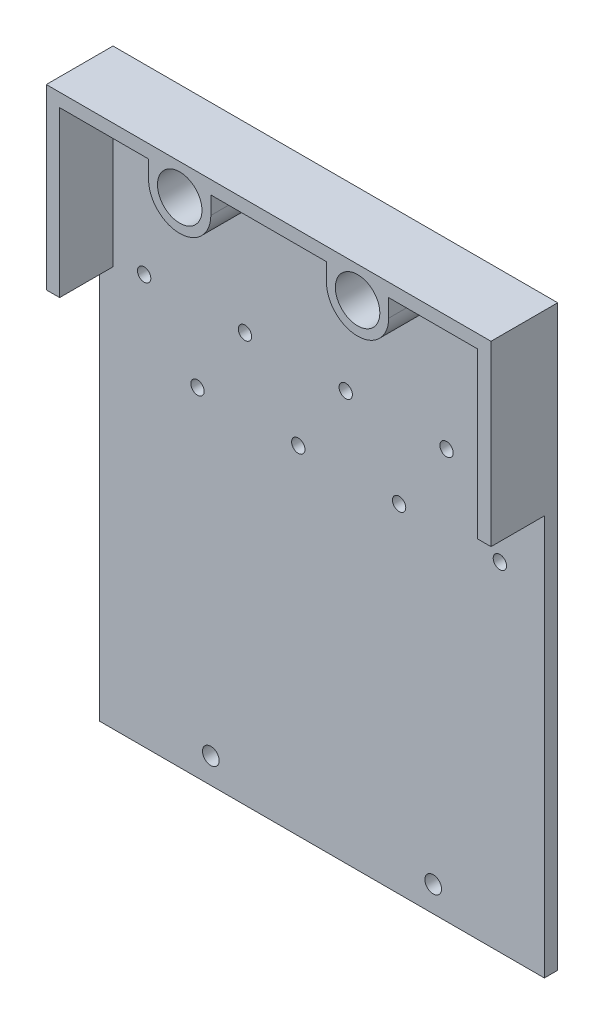
ISO-10303-21;
HEADER;
FILE_DESCRIPTION(('STEP AP214'),'2;1');
FILE_NAME('part.step','',(''),(''),'','','');
FILE_SCHEMA(('AUTOMOTIVE_DESIGN { 1 0 10303 214 1 1 1 1 }'));
ENDSEC;
DATA;
#1=APPLICATION_CONTEXT('core data for automotive mechanical design processes');
#2=APPLICATION_PROTOCOL_DEFINITION('international standard','automotive_design',2000,#1);
#3=PRODUCT_CONTEXT('',#1,'mechanical');
#4=PRODUCT('Part','Part','',(#3));
#5=PRODUCT_RELATED_PRODUCT_CATEGORY('part','',(#4));
#6=PRODUCT_DEFINITION_FORMATION('','',#4);
#7=PRODUCT_DEFINITION_CONTEXT('part definition',#1,'design');
#8=PRODUCT_DEFINITION('design','',#6,#7);
#9=PRODUCT_DEFINITION_SHAPE('','',#8);
#10=(LENGTH_UNIT() NAMED_UNIT(*) SI_UNIT(.MILLI.,.METRE.));
#11=(NAMED_UNIT(*) PLANE_ANGLE_UNIT() SI_UNIT($,.RADIAN.));
#12=(NAMED_UNIT(*) SI_UNIT($,.STERADIAN.) SOLID_ANGLE_UNIT());
#13=UNCERTAINTY_MEASURE_WITH_UNIT(LENGTH_MEASURE(1.E-05),#10,'distance_accuracy_value','');
#14=(GEOMETRIC_REPRESENTATION_CONTEXT(3) GLOBAL_UNCERTAINTY_ASSIGNED_CONTEXT((#13)) GLOBAL_UNIT_ASSIGNED_CONTEXT((#10,
#11,#12)) REPRESENTATION_CONTEXT('',''));
#15=CARTESIAN_POINT('',(0.,0.,0.));
#16=DIRECTION('',(0.,0.,1.));
#17=DIRECTION('',(1.,0.,0.));
#18=AXIS2_PLACEMENT_3D('',#15,#16,#17);
#19=CARTESIAN_POINT('',(0.,0.,3.));
#20=DIRECTION('',(0.,0.,1.));
#21=DIRECTION('',(1.,0.,0.));
#22=AXIS2_PLACEMENT_3D('',#19,#20,#21);
#23=PLANE('',#22);
#24=DIRECTION('',(1.,0.,0.));
#25=VECTOR('',#24,1.);
#26=CARTESIAN_POINT('',(0.,90.,3.));
#27=LINE('',#26,#25);
#28=CARTESIAN_POINT('',(0.,90.,3.));
#29=VERTEX_POINT('',#28);
#30=CARTESIAN_POINT('',(3.00000000000001,90.,3.));
#31=VERTEX_POINT('',#30);
#32=EDGE_CURVE('E351',#29,#31,#27,.T.);
#33=ORIENTED_EDGE('',*,*,#32,.F.);
#34=DIRECTION('',(0.,1.,0.));
#35=VECTOR('',#34,1.);
#36=CARTESIAN_POINT('',(0.,0.,3.));
#37=LINE('',#36,#35);
#38=CARTESIAN_POINT('',(0.,0.,3.));
#39=VERTEX_POINT('',#38);
#40=EDGE_CURVE('E379',#39,#29,#37,.T.);
#41=ORIENTED_EDGE('',*,*,#40,.F.);
#42=DIRECTION('',(1.,0.,0.));
#43=VECTOR('',#42,1.);
#44=CARTESIAN_POINT('',(0.,0.,3.));
#45=LINE('',#44,#43);
#46=CARTESIAN_POINT('',(100.,0.,3.));
#47=VERTEX_POINT('',#46);
#48=EDGE_CURVE('E56',#39,#47,#45,.T.);
#49=ORIENTED_EDGE('',*,*,#48,.T.);
#50=DIRECTION('',(0.,1.,0.));
#51=VECTOR('',#50,1.);
#52=CARTESIAN_POINT('',(100.,0.,3.));
#53=LINE('',#52,#51);
#54=CARTESIAN_POINT('',(100.,90.,3.));
#55=VERTEX_POINT('',#54);
#56=EDGE_CURVE('E383',#47,#55,#53,.T.);
#57=ORIENTED_EDGE('',*,*,#56,.T.);
#58=DIRECTION('',(1.,0.,0.));
#59=VECTOR('',#58,1.);
#60=CARTESIAN_POINT('',(0.,90.,3.));
#61=LINE('',#60,#59);
#62=CARTESIAN_POINT('',(97.,90.,3.));
#63=VERTEX_POINT('',#62);
#64=EDGE_CURVE('E327',#63,#55,#61,.T.);
#65=ORIENTED_EDGE('',*,*,#64,.F.);
#66=DIRECTION('',(0.,1.,0.));
#67=VECTOR('',#66,1.);
#68=CARTESIAN_POINT('',(97.,0.,3.));
#69=LINE('',#68,#67);
#70=CARTESIAN_POINT('',(97.,127.,3.));
#71=VERTEX_POINT('',#70);
#72=EDGE_CURVE('E330',#63,#71,#69,.T.);
#73=ORIENTED_EDGE('',*,*,#72,.T.);
#74=DIRECTION('',(1.,0.,0.));
#75=VECTOR('',#74,1.);
#76=CARTESIAN_POINT('',(0.,127.,3.));
#77=LINE('',#76,#75);
#78=CARTESIAN_POINT('',(77.,127.,3.));
#79=VERTEX_POINT('',#78);
#80=EDGE_CURVE('E385',#79,#71,#77,.T.);
#81=ORIENTED_EDGE('',*,*,#80,.F.);
#82=DIRECTION('',(0.,-1.,0.));
#83=VECTOR('',#82,1.);
#84=CARTESIAN_POINT('',(77.,0.,3.));
#85=LINE('',#84,#83);
#86=CARTESIAN_POINT('',(77.,123.,3.));
#87=VERTEX_POINT('',#86);
#88=EDGE_CURVE('E333',#79,#87,#85,.T.);
#89=ORIENTED_EDGE('',*,*,#88,.T.);
#90=CARTESIAN_POINT('',(70.,123.,3.));
#91=DIRECTION('',(0.,0.,1.));
#92=DIRECTION('',(1.,0.,0.));
#93=AXIS2_PLACEMENT_3D('',#90,#91,#92);
#94=CIRCLE('',#93,7.);
#95=CARTESIAN_POINT('',(63.,123.,3.));
#96=VERTEX_POINT('',#95);
#97=EDGE_CURVE('E336',#87,#96,#94,.F.);
#98=ORIENTED_EDGE('',*,*,#97,.T.);
#99=DIRECTION('',(0.,-1.,0.));
#100=VECTOR('',#99,1.);
#101=CARTESIAN_POINT('',(63.,0.,3.));
#102=LINE('',#101,#100);
#103=CARTESIAN_POINT('',(63.,127.,3.));
#104=VERTEX_POINT('',#103);
#105=EDGE_CURVE('E339',#104,#96,#102,.T.);
#106=ORIENTED_EDGE('',*,*,#105,.F.);
#107=DIRECTION('',(1.,0.,0.));
#108=VECTOR('',#107,1.);
#109=CARTESIAN_POINT('',(0.,127.,3.));
#110=LINE('',#109,#108);
#111=CARTESIAN_POINT('',(37.,127.,3.));
#112=VERTEX_POINT('',#111);
#113=EDGE_CURVE('E373',#112,#104,#110,.T.);
#114=ORIENTED_EDGE('',*,*,#113,.F.);
#115=DIRECTION('',(0.,-1.,0.));
#116=VECTOR('',#115,1.);
#117=CARTESIAN_POINT('',(37.,0.,3.));
#118=LINE('',#117,#116);
#119=CARTESIAN_POINT('',(37.,123.,3.));
#120=VERTEX_POINT('',#119);
#121=EDGE_CURVE('E342',#112,#120,#118,.T.);
#122=ORIENTED_EDGE('',*,*,#121,.T.);
#123=CARTESIAN_POINT('',(30.,123.,3.));
#124=DIRECTION('',(0.,0.,1.));
#125=DIRECTION('',(1.,0.,0.));
#126=AXIS2_PLACEMENT_3D('',#123,#124,#125);
#127=CIRCLE('',#126,7.00000000000001);
#128=CARTESIAN_POINT('',(23.,123.,3.));
#129=VERTEX_POINT('',#128);
#130=EDGE_CURVE('E116',#129,#120,#127,.T.);
#131=ORIENTED_EDGE('',*,*,#130,.F.);
#132=DIRECTION('',(0.,-1.,0.));
#133=VECTOR('',#132,1.);
#134=CARTESIAN_POINT('',(23.,0.,3.));
#135=LINE('',#134,#133);
#136=CARTESIAN_POINT('',(23.,127.,3.));
#137=VERTEX_POINT('',#136);
#138=EDGE_CURVE('E345',#137,#129,#135,.T.);
#139=ORIENTED_EDGE('',*,*,#138,.F.);
#140=DIRECTION('',(1.,0.,0.));
#141=VECTOR('',#140,1.);
#142=CARTESIAN_POINT('',(0.,127.,3.));
#143=LINE('',#142,#141);
#144=CARTESIAN_POINT('',(3.,127.,3.));
#145=VERTEX_POINT('',#144);
#146=EDGE_CURVE('E376',#145,#137,#143,.T.);
#147=ORIENTED_EDGE('',*,*,#146,.F.);
#148=DIRECTION('',(0.,-1.,0.));
#149=VECTOR('',#148,1.);
#150=CARTESIAN_POINT('',(3.00000000000002,0.,3.));
#151=LINE('',#150,#149);
#152=EDGE_CURVE('E348',#145,#31,#151,.T.);
#153=ORIENTED_EDGE('',*,*,#152,.T.);
#154=EDGE_LOOP('',(#33,#41,#49,#57,#65,#73,#81,#89,#98,#106,#114,#122,#131,#139,#147,#153));
#155=FACE_BOUND('',#154,.T.);
#156=CARTESIAN_POINT('',(44.6666666666667,76.,3.));
#157=DIRECTION('',(0.,0.,1.));
#158=DIRECTION('',(1.,0.,0.));
#159=AXIS2_PLACEMENT_3D('',#156,#157,#158);
#160=CIRCLE('',#159,1.5);
#161=CARTESIAN_POINT('',(46.1666666666667,76.,3.));
#162=VERTEX_POINT('',#161);
#163=EDGE_CURVE('E355',#162,#162,#160,.T.);
#164=ORIENTED_EDGE('',*,*,#163,.F.);
#165=EDGE_LOOP('',(#164));
#166=FACE_BOUND('',#165,.T.);
#167=CARTESIAN_POINT('',(32.6666666666666,92.,3.));
#168=DIRECTION('',(0.,0.,1.));
#169=DIRECTION('',(1.,0.,0.));
#170=AXIS2_PLACEMENT_3D('',#167,#168,#169);
#171=CIRCLE('',#170,1.5);
#172=CARTESIAN_POINT('',(34.1666666666666,92.,3.));
#173=VERTEX_POINT('',#172);
#174=EDGE_CURVE('E359',#173,#173,#171,.T.);
#175=ORIENTED_EDGE('',*,*,#174,.F.);
#176=EDGE_LOOP('',(#175));
#177=FACE_BOUND('',#176,.T.);
#178=CARTESIAN_POINT('',(9.9999999999999,92.,3.));
#179=DIRECTION('',(0.,0.,1.));
#180=DIRECTION('',(1.,0.,0.));
#181=AXIS2_PLACEMENT_3D('',#178,#179,#180);
#182=CIRCLE('',#181,1.5);
#183=CARTESIAN_POINT('',(11.4999999999999,92.,3.));
#184=VERTEX_POINT('',#183);
#185=EDGE_CURVE('E363',#184,#184,#182,.T.);
#186=ORIENTED_EDGE('',*,*,#185,.F.);
#187=EDGE_LOOP('',(#186));
#188=FACE_BOUND('',#187,.T.);
#189=CARTESIAN_POINT('',(22.,76.,3.));
#190=DIRECTION('',(0.,0.,1.));
#191=DIRECTION('',(1.,0.,0.));
#192=AXIS2_PLACEMENT_3D('',#189,#190,#191);
#193=CIRCLE('',#192,1.5);
#194=CARTESIAN_POINT('',(23.5,76.,3.));
#195=VERTEX_POINT('',#194);
#196=EDGE_CURVE('E364',#195,#195,#193,.T.);
#197=ORIENTED_EDGE('',*,*,#196,.F.);
#198=EDGE_LOOP('',(#197));
#199=FACE_BOUND('',#198,.T.);
#200=CARTESIAN_POINT('',(25.,5.74999999999999,3.));
#201=DIRECTION('',(0.,0.,1.));
#202=DIRECTION('',(1.,0.,0.));
#203=AXIS2_PLACEMENT_3D('',#200,#201,#202);
#204=CIRCLE('',#203,1.875);
#205=CARTESIAN_POINT('',(26.875,5.74999999999999,3.));
#206=VERTEX_POINT('',#205);
#207=EDGE_CURVE('E388',#206,#206,#204,.T.);
#208=ORIENTED_EDGE('',*,*,#207,.F.);
#209=EDGE_LOOP('',(#208));
#210=FACE_BOUND('',#209,.T.);
#211=CARTESIAN_POINT('',(75.,5.75,3.));
#212=DIRECTION('',(0.,0.,1.));
#213=DIRECTION('',(1.,0.,0.));
#214=AXIS2_PLACEMENT_3D('',#211,#212,#213);
#215=CIRCLE('',#214,1.875);
#216=CARTESIAN_POINT('',(76.875,5.75,3.));
#217=VERTEX_POINT('',#216);
#218=EDGE_CURVE('E98',#217,#217,#215,.T.);
#219=ORIENTED_EDGE('',*,*,#218,.F.);
#220=EDGE_LOOP('',(#219));
#221=FACE_BOUND('',#220,.T.);
#222=CARTESIAN_POINT('',(55.3333333333333,92.,3.));
#223=DIRECTION('',(0.,0.,1.));
#224=DIRECTION('',(1.,0.,0.));
#225=AXIS2_PLACEMENT_3D('',#222,#223,#224);
#226=CIRCLE('',#225,1.5);
#227=CARTESIAN_POINT('',(56.8333333333333,92.,3.));
#228=VERTEX_POINT('',#227);
#229=EDGE_CURVE('E126',#228,#228,#226,.T.);
#230=ORIENTED_EDGE('',*,*,#229,.F.);
#231=EDGE_LOOP('',(#230));
#232=FACE_BOUND('',#231,.T.);
#233=CARTESIAN_POINT('',(77.9999999999999,92.,3.));
#234=DIRECTION('',(0.,0.,1.));
#235=DIRECTION('',(1.,0.,0.));
#236=AXIS2_PLACEMENT_3D('',#233,#234,#235);
#237=CIRCLE('',#236,1.5);
#238=CARTESIAN_POINT('',(79.4999999999999,92.,3.));
#239=VERTEX_POINT('',#238);
#240=EDGE_CURVE('E132',#239,#239,#237,.T.);
#241=ORIENTED_EDGE('',*,*,#240,.F.);
#242=EDGE_LOOP('',(#241));
#243=FACE_BOUND('',#242,.T.);
#244=CARTESIAN_POINT('',(67.3333333333333,76.,3.));
#245=DIRECTION('',(0.,0.,1.));
#246=DIRECTION('',(1.,0.,0.));
#247=AXIS2_PLACEMENT_3D('',#244,#245,#246);
#248=CIRCLE('',#247,1.5);
#249=CARTESIAN_POINT('',(68.8333333333333,76.,3.));
#250=VERTEX_POINT('',#249);
#251=EDGE_CURVE('E138',#250,#250,#248,.T.);
#252=ORIENTED_EDGE('',*,*,#251,.F.);
#253=EDGE_LOOP('',(#252));
#254=FACE_BOUND('',#253,.T.);
#255=CARTESIAN_POINT('',(90.,76.,3.));
#256=DIRECTION('',(0.,0.,1.));
#257=DIRECTION('',(1.,0.,0.));
#258=AXIS2_PLACEMENT_3D('',#255,#256,#257);
#259=CIRCLE('',#258,1.5);
#260=CARTESIAN_POINT('',(91.5,76.,3.));
#261=VERTEX_POINT('',#260);
#262=EDGE_CURVE('E11',#261,#261,#259,.T.);
#263=ORIENTED_EDGE('',*,*,#262,.F.);
#264=EDGE_LOOP('',(#263));
#265=FACE_BOUND('',#264,.T.);
#266=ADVANCED_FACE('F39',(#155,#166,#177,#188,#199,#210,#221,#232,#243,#254,#265),#23,.T.);
#267=CARTESIAN_POINT('',(90.,76.,7.24264068711929));
#268=DIRECTION('',(0.,0.,-1.));
#269=DIRECTION('',(-1.,0.,0.));
#270=AXIS2_PLACEMENT_3D('',#267,#268,#269);
#271=CYLINDRICAL_SURFACE('',#270,1.5);
#272=CARTESIAN_POINT('',(90.,76.,0.));
#273=DIRECTION('',(0.,0.,-1.));
#274=DIRECTION('',(-1.,0.,0.));
#275=AXIS2_PLACEMENT_3D('',#272,#273,#274);
#276=CIRCLE('',#275,1.5);
#277=CARTESIAN_POINT('',(88.5,76.,0.));
#278=VERTEX_POINT('',#277);
#279=EDGE_CURVE('E48',#278,#278,#276,.F.);
#280=ORIENTED_EDGE('',*,*,#279,.F.);
#281=EDGE_LOOP('',(#280));
#282=FACE_BOUND('',#281,.T.);
#283=ORIENTED_EDGE('',*,*,#262,.T.);
#284=EDGE_LOOP('',(#283));
#285=FACE_BOUND('',#284,.T.);
#286=ADVANCED_FACE('F41',(#282,#285),#271,.F.);
#287=CARTESIAN_POINT('',(67.3333333333333,76.,7.24264068711929));
#288=DIRECTION('',(0.,0.,-1.));
#289=DIRECTION('',(-1.,0.,0.));
#290=AXIS2_PLACEMENT_3D('',#287,#288,#289);
#291=CYLINDRICAL_SURFACE('',#290,1.5);
#292=CARTESIAN_POINT('',(67.3333333333333,76.,0.));
#293=DIRECTION('',(0.,0.,-1.));
#294=DIRECTION('',(-1.,0.,0.));
#295=AXIS2_PLACEMENT_3D('',#292,#293,#294);
#296=CIRCLE('',#295,1.5);
#297=CARTESIAN_POINT('',(65.8333333333333,76.,0.));
#298=VERTEX_POINT('',#297);
#299=EDGE_CURVE('E135',#298,#298,#296,.F.);
#300=ORIENTED_EDGE('',*,*,#299,.F.);
#301=EDGE_LOOP('',(#300));
#302=FACE_BOUND('',#301,.T.);
#303=ORIENTED_EDGE('',*,*,#251,.T.);
#304=EDGE_LOOP('',(#303));
#305=FACE_BOUND('',#304,.T.);
#306=ADVANCED_FACE('F147',(#302,#305),#291,.F.);
#307=CARTESIAN_POINT('',(77.9999999999999,92.,7.24264068711929));
#308=DIRECTION('',(0.,0.,-1.));
#309=DIRECTION('',(-1.,0.,0.));
#310=AXIS2_PLACEMENT_3D('',#307,#308,#309);
#311=CYLINDRICAL_SURFACE('',#310,1.5);
#312=CARTESIAN_POINT('',(77.9999999999999,92.,0.));
#313=DIRECTION('',(0.,0.,-1.));
#314=DIRECTION('',(-1.,0.,0.));
#315=AXIS2_PLACEMENT_3D('',#312,#313,#314);
#316=CIRCLE('',#315,1.5);
#317=CARTESIAN_POINT('',(76.4999999999999,92.,0.));
#318=VERTEX_POINT('',#317);
#319=EDGE_CURVE('E129',#318,#318,#316,.F.);
#320=ORIENTED_EDGE('',*,*,#319,.F.);
#321=EDGE_LOOP('',(#320));
#322=FACE_BOUND('',#321,.T.);
#323=ORIENTED_EDGE('',*,*,#240,.T.);
#324=EDGE_LOOP('',(#323));
#325=FACE_BOUND('',#324,.T.);
#326=ADVANCED_FACE('F192',(#322,#325),#311,.F.);
#327=CARTESIAN_POINT('',(55.3333333333333,92.,7.24264068711929));
#328=DIRECTION('',(0.,0.,-1.));
#329=DIRECTION('',(-1.,0.,0.));
#330=AXIS2_PLACEMENT_3D('',#327,#328,#329);
#331=CYLINDRICAL_SURFACE('',#330,1.5);
#332=CARTESIAN_POINT('',(55.3333333333333,92.,0.));
#333=DIRECTION('',(0.,0.,-1.));
#334=DIRECTION('',(-1.,0.,0.));
#335=AXIS2_PLACEMENT_3D('',#332,#333,#334);
#336=CIRCLE('',#335,1.5);
#337=CARTESIAN_POINT('',(53.8333333333333,92.,0.));
#338=VERTEX_POINT('',#337);
#339=EDGE_CURVE('E123',#338,#338,#336,.F.);
#340=ORIENTED_EDGE('',*,*,#339,.F.);
#341=EDGE_LOOP('',(#340));
#342=FACE_BOUND('',#341,.T.);
#343=ORIENTED_EDGE('',*,*,#229,.T.);
#344=EDGE_LOOP('',(#343));
#345=FACE_BOUND('',#344,.T.);
#346=ADVANCED_FACE('F185',(#342,#345),#331,.F.);
#347=CARTESIAN_POINT('',(0.,0.,3.));
#348=DIRECTION('',(-1.,0.,0.));
#349=DIRECTION('',(0.,0.,1.));
#350=AXIS2_PLACEMENT_3D('',#347,#348,#349);
#351=PLANE('',#350);
#352=ORIENTED_EDGE('',*,*,#40,.T.);
#353=DIRECTION('',(0.,0.,-1.));
#354=VECTOR('',#353,1.);
#355=CARTESIAN_POINT('',(0.,90.,15.));
#356=LINE('',#355,#354);
#357=CARTESIAN_POINT('',(0.,90.,15.));
#358=VERTEX_POINT('',#357);
#359=EDGE_CURVE('E324',#358,#29,#356,.T.);
#360=ORIENTED_EDGE('',*,*,#359,.F.);
#361=DIRECTION('',(0.,1.,0.));
#362=VECTOR('',#361,1.);
#363=CARTESIAN_POINT('',(0.,0.,15.));
#364=LINE('',#363,#362);
#365=CARTESIAN_POINT('',(0.,130.,15.));
#366=VERTEX_POINT('',#365);
#367=EDGE_CURVE('E237',#358,#366,#364,.T.);
#368=ORIENTED_EDGE('',*,*,#367,.T.);
#369=DIRECTION('',(0.,0.,-1.));
#370=VECTOR('',#369,1.);
#371=CARTESIAN_POINT('',(0.,130.,3.));
#372=LINE('',#371,#370);
#373=CARTESIAN_POINT('',(0.,130.,0.));
#374=VERTEX_POINT('',#373);
#375=EDGE_CURVE('E121',#366,#374,#372,.T.);
#376=ORIENTED_EDGE('',*,*,#375,.T.);
#377=DIRECTION('',(0.,1.,0.));
#378=VECTOR('',#377,1.);
#379=CARTESIAN_POINT('',(0.,0.,0.));
#380=LINE('',#379,#378);
#381=CARTESIAN_POINT('',(0.,0.,0.));
#382=VERTEX_POINT('',#381);
#383=EDGE_CURVE('E103',#382,#374,#380,.T.);
#384=ORIENTED_EDGE('',*,*,#383,.F.);
#385=DIRECTION('',(0.,0.,-1.));
#386=VECTOR('',#385,1.);
#387=CARTESIAN_POINT('',(0.,0.,3.));
#388=LINE('',#387,#386);
#389=EDGE_CURVE('E119',#39,#382,#388,.T.);
#390=ORIENTED_EDGE('',*,*,#389,.F.);
#391=EDGE_LOOP('',(#352,#360,#368,#376,#384,#390));
#392=FACE_BOUND('',#391,.T.);
#393=ADVANCED_FACE('F182',(#392),#351,.T.);
#394=CARTESIAN_POINT('',(0.,0.,3.));
#395=DIRECTION('',(0.,1.,0.));
#396=DIRECTION('',(0.,0.,1.));
#397=AXIS2_PLACEMENT_3D('',#394,#395,#396);
#398=PLANE('',#397);
#399=DIRECTION('',(1.,0.,0.));
#400=VECTOR('',#399,1.);
#401=CARTESIAN_POINT('',(0.,0.,0.));
#402=LINE('',#401,#400);
#403=CARTESIAN_POINT('',(100.,0.,0.));
#404=VERTEX_POINT('',#403);
#405=EDGE_CURVE('E72',#382,#404,#402,.T.);
#406=ORIENTED_EDGE('',*,*,#405,.T.);
#407=DIRECTION('',(0.,0.,-1.));
#408=VECTOR('',#407,1.);
#409=CARTESIAN_POINT('',(100.,0.,3.));
#410=LINE('',#409,#408);
#411=EDGE_CURVE('E86',#47,#404,#410,.T.);
#412=ORIENTED_EDGE('',*,*,#411,.F.);
#413=ORIENTED_EDGE('',*,*,#48,.F.);
#414=ORIENTED_EDGE('',*,*,#389,.T.);
#415=EDGE_LOOP('',(#406,#412,#413,#414));
#416=FACE_BOUND('',#415,.T.);
#417=ADVANCED_FACE('F179',(#416),#398,.F.);
#418=CARTESIAN_POINT('',(100.,0.,3.));
#419=DIRECTION('',(-1.,0.,0.));
#420=DIRECTION('',(0.,0.,1.));
#421=AXIS2_PLACEMENT_3D('',#418,#419,#420);
#422=PLANE('',#421);
#423=DIRECTION('',(0.,1.,0.));
#424=VECTOR('',#423,1.);
#425=CARTESIAN_POINT('',(100.,0.,0.));
#426=LINE('',#425,#424);
#427=CARTESIAN_POINT('',(100.,130.,0.));
#428=VERTEX_POINT('',#427);
#429=EDGE_CURVE('E78',#404,#428,#426,.T.);
#430=ORIENTED_EDGE('',*,*,#429,.T.);
#431=DIRECTION('',(0.,0.,-1.));
#432=VECTOR('',#431,1.);
#433=CARTESIAN_POINT('',(100.,130.,3.));
#434=LINE('',#433,#432);
#435=CARTESIAN_POINT('',(100.,130.,15.));
#436=VERTEX_POINT('',#435);
#437=EDGE_CURVE('E83',#436,#428,#434,.T.);
#438=ORIENTED_EDGE('',*,*,#437,.F.);
#439=DIRECTION('',(0.,1.,0.));
#440=VECTOR('',#439,1.);
#441=CARTESIAN_POINT('',(100.,0.,15.));
#442=LINE('',#441,#440);
#443=CARTESIAN_POINT('',(100.,90.,15.));
#444=VERTEX_POINT('',#443);
#445=EDGE_CURVE('E283',#444,#436,#442,.T.);
#446=ORIENTED_EDGE('',*,*,#445,.F.);
#447=DIRECTION('',(0.,0.,-1.));
#448=VECTOR('',#447,1.);
#449=CARTESIAN_POINT('',(100.,90.,15.));
#450=LINE('',#449,#448);
#451=EDGE_CURVE('E285',#444,#55,#450,.T.);
#452=ORIENTED_EDGE('',*,*,#451,.T.);
#453=ORIENTED_EDGE('',*,*,#56,.F.);
#454=ORIENTED_EDGE('',*,*,#411,.T.);
#455=EDGE_LOOP('',(#430,#438,#446,#452,#453,#454));
#456=FACE_BOUND('',#455,.T.);
#457=ADVANCED_FACE('F80',(#456),#422,.F.);
#458=CARTESIAN_POINT('',(0.,130.,3.));
#459=DIRECTION('',(0.,1.,0.));
#460=DIRECTION('',(0.,0.,1.));
#461=AXIS2_PLACEMENT_3D('',#458,#459,#460);
#462=PLANE('',#461);
#463=DIRECTION('',(1.,0.,0.));
#464=VECTOR('',#463,1.);
#465=CARTESIAN_POINT('',(0.,130.,0.));
#466=LINE('',#465,#464);
#467=EDGE_CURVE('E89',#374,#428,#466,.T.);
#468=ORIENTED_EDGE('',*,*,#467,.F.);
#469=ORIENTED_EDGE('',*,*,#375,.F.);
#470=DIRECTION('',(1.,0.,0.));
#471=VECTOR('',#470,1.);
#472=CARTESIAN_POINT('',(0.,130.,15.));
#473=LINE('',#472,#471);
#474=EDGE_CURVE('E97',#366,#436,#473,.T.);
#475=ORIENTED_EDGE('',*,*,#474,.T.);
#476=ORIENTED_EDGE('',*,*,#437,.T.);
#477=EDGE_LOOP('',(#468,#469,#475,#476));
#478=FACE_BOUND('',#477,.T.);
#479=ADVANCED_FACE('F93',(#478),#462,.T.);
#480=CARTESIAN_POINT('',(30.,123.,3.));
#481=DIRECTION('',(0.,0.,-1.));
#482=DIRECTION('',(-1.,0.,0.));
#483=AXIS2_PLACEMENT_3D('',#480,#481,#482);
#484=CYLINDRICAL_SURFACE('',#483,5.00000000000001);
#485=CARTESIAN_POINT('',(30.,123.,0.));
#486=DIRECTION('',(0.,0.,1.));
#487=DIRECTION('',(1.,0.,0.));
#488=AXIS2_PLACEMENT_3D('',#485,#486,#487);
#489=CIRCLE('',#488,5.00000000000001);
#490=CARTESIAN_POINT('',(35.,123.,0.));
#491=VERTEX_POINT('',#490);
#492=EDGE_CURVE('E367',#491,#491,#489,.T.);
#493=ORIENTED_EDGE('',*,*,#492,.F.);
#494=EDGE_LOOP('',(#493));
#495=FACE_BOUND('',#494,.T.);
#496=CARTESIAN_POINT('',(30.,123.,15.));
#497=DIRECTION('',(0.,0.,1.));
#498=DIRECTION('',(1.,0.,0.));
#499=AXIS2_PLACEMENT_3D('',#496,#497,#498);
#500=CIRCLE('',#499,5.00000000000001);
#501=CARTESIAN_POINT('',(35.,123.,15.));
#502=VERTEX_POINT('',#501);
#503=EDGE_CURVE('E235',#502,#502,#500,.T.);
#504=ORIENTED_EDGE('',*,*,#503,.T.);
#505=EDGE_LOOP('',(#504));
#506=FACE_BOUND('',#505,.T.);
#507=ADVANCED_FACE('F170',(#495,#506),#484,.F.);
#508=CARTESIAN_POINT('',(25.,5.74999999999999,3.));
#509=DIRECTION('',(0.,0.,-1.));
#510=DIRECTION('',(-1.,0.,0.));
#511=AXIS2_PLACEMENT_3D('',#508,#509,#510);
#512=CYLINDRICAL_SURFACE('',#511,1.875);
#513=ORIENTED_EDGE('',*,*,#207,.T.);
#514=EDGE_LOOP('',(#513));
#515=FACE_BOUND('',#514,.T.);
#516=CARTESIAN_POINT('',(25.,5.74999999999999,0.));
#517=DIRECTION('',(0.,0.,1.));
#518=DIRECTION('',(1.,0.,0.));
#519=AXIS2_PLACEMENT_3D('',#516,#517,#518);
#520=CIRCLE('',#519,1.875);
#521=CARTESIAN_POINT('',(26.875,5.74999999999999,0.));
#522=VERTEX_POINT('',#521);
#523=EDGE_CURVE('E108',#522,#522,#520,.T.);
#524=ORIENTED_EDGE('',*,*,#523,.F.);
#525=EDGE_LOOP('',(#524));
#526=FACE_BOUND('',#525,.T.);
#527=ADVANCED_FACE('F167',(#515,#526),#512,.F.);
#528=CARTESIAN_POINT('',(70.,123.,3.));
#529=DIRECTION('',(0.,0.,-1.));
#530=DIRECTION('',(-1.,0.,0.));
#531=AXIS2_PLACEMENT_3D('',#528,#529,#530);
#532=CYLINDRICAL_SURFACE('',#531,5.00000000000001);
#533=CARTESIAN_POINT('',(70.,123.,0.));
#534=DIRECTION('',(0.,0.,1.));
#535=DIRECTION('',(1.,0.,0.));
#536=AXIS2_PLACEMENT_3D('',#533,#534,#535);
#537=CIRCLE('',#536,5.00000000000001);
#538=CARTESIAN_POINT('',(75.,123.,0.));
#539=VERTEX_POINT('',#538);
#540=EDGE_CURVE('E105',#539,#539,#537,.T.);
#541=ORIENTED_EDGE('',*,*,#540,.F.);
#542=EDGE_LOOP('',(#541));
#543=FACE_BOUND('',#542,.T.);
#544=CARTESIAN_POINT('',(70.,123.,15.));
#545=DIRECTION('',(0.,0.,1.));
#546=DIRECTION('',(1.,0.,0.));
#547=AXIS2_PLACEMENT_3D('',#544,#545,#546);
#548=CIRCLE('',#547,5.00000000000001);
#549=CARTESIAN_POINT('',(75.,123.,15.));
#550=VERTEX_POINT('',#549);
#551=EDGE_CURVE('E233',#550,#550,#548,.T.);
#552=ORIENTED_EDGE('',*,*,#551,.T.);
#553=EDGE_LOOP('',(#552));
#554=FACE_BOUND('',#553,.T.);
#555=ADVANCED_FACE('F165',(#543,#554),#532,.F.);
#556=CARTESIAN_POINT('',(75.,5.75,3.));
#557=DIRECTION('',(0.,0.,-1.));
#558=DIRECTION('',(-1.,0.,0.));
#559=AXIS2_PLACEMENT_3D('',#556,#557,#558);
#560=CYLINDRICAL_SURFACE('',#559,1.875);
#561=ORIENTED_EDGE('',*,*,#218,.T.);
#562=EDGE_LOOP('',(#561));
#563=FACE_BOUND('',#562,.T.);
#564=CARTESIAN_POINT('',(75.,5.75,0.));
#565=DIRECTION('',(0.,0.,1.));
#566=DIRECTION('',(1.,0.,0.));
#567=AXIS2_PLACEMENT_3D('',#564,#565,#566);
#568=CIRCLE('',#567,1.875);
#569=CARTESIAN_POINT('',(76.875,5.75,0.));
#570=VERTEX_POINT('',#569);
#571=EDGE_CURVE('E114',#570,#570,#568,.T.);
#572=ORIENTED_EDGE('',*,*,#571,.F.);
#573=EDGE_LOOP('',(#572));
#574=FACE_BOUND('',#573,.T.);
#575=ADVANCED_FACE('F162',(#563,#574),#560,.F.);
#576=CARTESIAN_POINT('',(0.,0.,0.));
#577=DIRECTION('',(0.,0.,1.));
#578=DIRECTION('',(1.,0.,0.));
#579=AXIS2_PLACEMENT_3D('',#576,#577,#578);
#580=PLANE('',#579);
#581=ORIENTED_EDGE('',*,*,#383,.T.);
#582=ORIENTED_EDGE('',*,*,#467,.T.);
#583=ORIENTED_EDGE('',*,*,#429,.F.);
#584=ORIENTED_EDGE('',*,*,#405,.F.);
#585=EDGE_LOOP('',(#581,#582,#583,#584));
#586=FACE_BOUND('',#585,.T.);
#587=ORIENTED_EDGE('',*,*,#492,.T.);
#588=EDGE_LOOP('',(#587));
#589=FACE_BOUND('',#588,.T.);
#590=ORIENTED_EDGE('',*,*,#279,.T.);
#591=EDGE_LOOP('',(#590));
#592=FACE_BOUND('',#591,.T.);
#593=ORIENTED_EDGE('',*,*,#299,.T.);
#594=EDGE_LOOP('',(#593));
#595=FACE_BOUND('',#594,.T.);
#596=ORIENTED_EDGE('',*,*,#319,.T.);
#597=EDGE_LOOP('',(#596));
#598=FACE_BOUND('',#597,.T.);
#599=ORIENTED_EDGE('',*,*,#339,.T.);
#600=EDGE_LOOP('',(#599));
#601=FACE_BOUND('',#600,.T.);
#602=ORIENTED_EDGE('',*,*,#571,.T.);
#603=EDGE_LOOP('',(#602));
#604=FACE_BOUND('',#603,.T.);
#605=ORIENTED_EDGE('',*,*,#523,.T.);
#606=EDGE_LOOP('',(#605));
#607=FACE_BOUND('',#606,.T.);
#608=CARTESIAN_POINT('',(22.,76.,0.));
#609=DIRECTION('',(0.,0.,-1.));
#610=DIRECTION('',(-1.,0.,0.));
#611=AXIS2_PLACEMENT_3D('',#608,#609,#610);
#612=CIRCLE('',#611,1.5);
#613=CARTESIAN_POINT('',(20.5,76.,0.));
#614=VERTEX_POINT('',#613);
#615=EDGE_CURVE('E216',#614,#614,#612,.F.);
#616=ORIENTED_EDGE('',*,*,#615,.T.);
#617=EDGE_LOOP('',(#616));
#618=FACE_BOUND('',#617,.T.);
#619=CARTESIAN_POINT('',(9.9999999999999,92.,0.));
#620=DIRECTION('',(0.,0.,-1.));
#621=DIRECTION('',(-1.,0.,0.));
#622=AXIS2_PLACEMENT_3D('',#619,#620,#621);
#623=CIRCLE('',#622,1.5);
#624=CARTESIAN_POINT('',(8.4999999999999,92.,0.));
#625=VERTEX_POINT('',#624);
#626=EDGE_CURVE('E220',#625,#625,#623,.F.);
#627=ORIENTED_EDGE('',*,*,#626,.T.);
#628=EDGE_LOOP('',(#627));
#629=FACE_BOUND('',#628,.T.);
#630=CARTESIAN_POINT('',(32.6666666666666,92.,0.));
#631=DIRECTION('',(0.,0.,-1.));
#632=DIRECTION('',(-1.,0.,0.));
#633=AXIS2_PLACEMENT_3D('',#630,#631,#632);
#634=CIRCLE('',#633,1.5);
#635=CARTESIAN_POINT('',(31.1666666666666,92.,0.));
#636=VERTEX_POINT('',#635);
#637=EDGE_CURVE('E224',#636,#636,#634,.F.);
#638=ORIENTED_EDGE('',*,*,#637,.T.);
#639=EDGE_LOOP('',(#638));
#640=FACE_BOUND('',#639,.T.);
#641=CARTESIAN_POINT('',(44.6666666666667,76.,0.));
#642=DIRECTION('',(0.,0.,-1.));
#643=DIRECTION('',(-1.,0.,0.));
#644=AXIS2_PLACEMENT_3D('',#641,#642,#643);
#645=CIRCLE('',#644,1.5);
#646=CARTESIAN_POINT('',(43.1666666666667,76.,0.));
#647=VERTEX_POINT('',#646);
#648=EDGE_CURVE('E228',#647,#647,#645,.F.);
#649=ORIENTED_EDGE('',*,*,#648,.T.);
#650=EDGE_LOOP('',(#649));
#651=FACE_BOUND('',#650,.T.);
#652=ORIENTED_EDGE('',*,*,#540,.T.);
#653=EDGE_LOOP('',(#652));
#654=FACE_BOUND('',#653,.T.);
#655=ADVANCED_FACE('F100',(#586,#589,#592,#595,#598,#601,#604,#607,#618,#629,#640,#651,#654),
#580,.F.);
#656=CARTESIAN_POINT('',(22.,76.,7.24264068711929));
#657=DIRECTION('',(0.,0.,-1.));
#658=DIRECTION('',(-1.,0.,0.));
#659=AXIS2_PLACEMENT_3D('',#656,#657,#658);
#660=CYLINDRICAL_SURFACE('',#659,1.5);
#661=ORIENTED_EDGE('',*,*,#615,.F.);
#662=EDGE_LOOP('',(#661));
#663=FACE_BOUND('',#662,.T.);
#664=ORIENTED_EDGE('',*,*,#196,.T.);
#665=EDGE_LOOP('',(#664));
#666=FACE_BOUND('',#665,.T.);
#667=ADVANCED_FACE('F158',(#663,#666),#660,.F.);
#668=CARTESIAN_POINT('',(9.9999999999999,92.,7.24264068711929));
#669=DIRECTION('',(0.,0.,-1.));
#670=DIRECTION('',(-1.,0.,0.));
#671=AXIS2_PLACEMENT_3D('',#668,#669,#670);
#672=CYLINDRICAL_SURFACE('',#671,1.5);
#673=ORIENTED_EDGE('',*,*,#626,.F.);
#674=EDGE_LOOP('',(#673));
#675=FACE_BOUND('',#674,.T.);
#676=ORIENTED_EDGE('',*,*,#185,.T.);
#677=EDGE_LOOP('',(#676));
#678=FACE_BOUND('',#677,.T.);
#679=ADVANCED_FACE('F561',(#675,#678),#672,.F.);
#680=CARTESIAN_POINT('',(32.6666666666666,92.,7.24264068711929));
#681=DIRECTION('',(0.,0.,-1.));
#682=DIRECTION('',(-1.,0.,0.));
#683=AXIS2_PLACEMENT_3D('',#680,#681,#682);
#684=CYLINDRICAL_SURFACE('',#683,1.5);
#685=ORIENTED_EDGE('',*,*,#637,.F.);
#686=EDGE_LOOP('',(#685));
#687=FACE_BOUND('',#686,.T.);
#688=ORIENTED_EDGE('',*,*,#174,.T.);
#689=EDGE_LOOP('',(#688));
#690=FACE_BOUND('',#689,.T.);
#691=ADVANCED_FACE('F558',(#687,#690),#684,.F.);
#692=CARTESIAN_POINT('',(44.6666666666667,76.,7.24264068711929));
#693=DIRECTION('',(0.,0.,-1.));
#694=DIRECTION('',(-1.,0.,0.));
#695=AXIS2_PLACEMENT_3D('',#692,#693,#694);
#696=CYLINDRICAL_SURFACE('',#695,1.5);
#697=ORIENTED_EDGE('',*,*,#648,.F.);
#698=EDGE_LOOP('',(#697));
#699=FACE_BOUND('',#698,.T.);
#700=ORIENTED_EDGE('',*,*,#163,.T.);
#701=EDGE_LOOP('',(#700));
#702=FACE_BOUND('',#701,.T.);
#703=ADVANCED_FACE('F555',(#699,#702),#696,.F.);
#704=CARTESIAN_POINT('',(0.,90.,15.));
#705=DIRECTION('',(0.,-1.,0.));
#706=DIRECTION('',(0.,0.,-1.));
#707=AXIS2_PLACEMENT_3D('',#704,#705,#706);
#708=PLANE('',#707);
#709=ORIENTED_EDGE('',*,*,#359,.T.);
#710=ORIENTED_EDGE('',*,*,#32,.T.);
#711=DIRECTION('',(0.,0.,-1.));
#712=VECTOR('',#711,1.);
#713=CARTESIAN_POINT('',(3.00000000000001,90.,15.));
#714=LINE('',#713,#712);
#715=CARTESIAN_POINT('',(3.00000000000001,90.,15.));
#716=VERTEX_POINT('',#715);
#717=EDGE_CURVE('E321',#716,#31,#714,.T.);
#718=ORIENTED_EDGE('',*,*,#717,.F.);
#719=DIRECTION('',(-1.,0.,0.));
#720=VECTOR('',#719,1.);
#721=CARTESIAN_POINT('',(0.,90.,15.));
#722=LINE('',#721,#720);
#723=EDGE_CURVE('E244',#716,#358,#722,.T.);
#724=ORIENTED_EDGE('',*,*,#723,.T.);
#725=EDGE_LOOP('',(#709,#710,#718,#724));
#726=FACE_BOUND('',#725,.T.);
#727=ADVANCED_FACE('F414',(#726),#708,.T.);
#728=CARTESIAN_POINT('',(3.00000000000002,0.,15.));
#729=DIRECTION('',(-1.,0.,0.));
#730=DIRECTION('',(0.,-1.,0.));
#731=AXIS2_PLACEMENT_3D('',#728,#729,#730);
#732=PLANE('',#731);
#733=ORIENTED_EDGE('',*,*,#152,.F.);
#734=DIRECTION('',(0.,0.,-1.));
#735=VECTOR('',#734,1.);
#736=CARTESIAN_POINT('',(3.,127.,15.));
#737=LINE('',#736,#735);
#738=CARTESIAN_POINT('',(3.,127.,15.));
#739=VERTEX_POINT('',#738);
#740=EDGE_CURVE('E318',#739,#145,#737,.T.);
#741=ORIENTED_EDGE('',*,*,#740,.F.);
#742=DIRECTION('',(0.,1.,0.));
#743=VECTOR('',#742,1.);
#744=CARTESIAN_POINT('',(3.00000000000002,0.,15.));
#745=LINE('',#744,#743);
#746=EDGE_CURVE('E247',#716,#739,#745,.T.);
#747=ORIENTED_EDGE('',*,*,#746,.F.);
#748=ORIENTED_EDGE('',*,*,#717,.T.);
#749=EDGE_LOOP('',(#733,#741,#747,#748));
#750=FACE_BOUND('',#749,.T.);
#751=ADVANCED_FACE('F424',(#750),#732,.F.);
#752=CARTESIAN_POINT('',(0.,127.,15.));
#753=DIRECTION('',(0.,1.,0.));
#754=DIRECTION('',(0.,0.,1.));
#755=AXIS2_PLACEMENT_3D('',#752,#753,#754);
#756=PLANE('',#755);
#757=ORIENTED_EDGE('',*,*,#146,.T.);
#758=DIRECTION('',(0.,0.,-1.));
#759=VECTOR('',#758,1.);
#760=CARTESIAN_POINT('',(23.,127.,15.));
#761=LINE('',#760,#759);
#762=CARTESIAN_POINT('',(23.,127.,15.));
#763=VERTEX_POINT('',#762);
#764=EDGE_CURVE('E315',#763,#137,#761,.T.);
#765=ORIENTED_EDGE('',*,*,#764,.F.);
#766=DIRECTION('',(1.,0.,0.));
#767=VECTOR('',#766,1.);
#768=CARTESIAN_POINT('',(0.,127.,15.));
#769=LINE('',#768,#767);
#770=EDGE_CURVE('E250',#739,#763,#769,.T.);
#771=ORIENTED_EDGE('',*,*,#770,.F.);
#772=ORIENTED_EDGE('',*,*,#740,.T.);
#773=EDGE_LOOP('',(#757,#765,#771,#772));
#774=FACE_BOUND('',#773,.T.);
#775=ADVANCED_FACE('F431',(#774),#756,.F.);
#776=CARTESIAN_POINT('',(23.,0.,15.));
#777=DIRECTION('',(-1.,0.,0.));
#778=DIRECTION('',(0.,0.,1.));
#779=AXIS2_PLACEMENT_3D('',#776,#777,#778);
#780=PLANE('',#779);
#781=ORIENTED_EDGE('',*,*,#764,.T.);
#782=ORIENTED_EDGE('',*,*,#138,.T.);
#783=DIRECTION('',(0.,0.,-1.));
#784=VECTOR('',#783,1.);
#785=CARTESIAN_POINT('',(23.,123.,15.));
#786=LINE('',#785,#784);
#787=CARTESIAN_POINT('',(23.,123.,15.));
#788=VERTEX_POINT('',#787);
#789=EDGE_CURVE('E312',#788,#129,#786,.T.);
#790=ORIENTED_EDGE('',*,*,#789,.F.);
#791=DIRECTION('',(0.,1.,0.));
#792=VECTOR('',#791,1.);
#793=CARTESIAN_POINT('',(23.,0.,15.));
#794=LINE('',#793,#792);
#795=EDGE_CURVE('E253',#788,#763,#794,.T.);
#796=ORIENTED_EDGE('',*,*,#795,.T.);
#797=EDGE_LOOP('',(#781,#782,#790,#796));
#798=FACE_BOUND('',#797,.T.);
#799=ADVANCED_FACE('F493',(#798),#780,.T.);
#800=CARTESIAN_POINT('',(30.,123.,15.));
#801=DIRECTION('',(0.,0.,-1.));
#802=DIRECTION('',(-1.,0.,0.));
#803=AXIS2_PLACEMENT_3D('',#800,#801,#802);
#804=CYLINDRICAL_SURFACE('',#803,7.00000000000001);
#805=ORIENTED_EDGE('',*,*,#130,.T.);
#806=DIRECTION('',(0.,0.,-1.));
#807=VECTOR('',#806,1.);
#808=CARTESIAN_POINT('',(37.,123.,15.));
#809=LINE('',#808,#807);
#810=CARTESIAN_POINT('',(37.,123.,15.));
#811=VERTEX_POINT('',#810);
#812=EDGE_CURVE('E309',#811,#120,#809,.T.);
#813=ORIENTED_EDGE('',*,*,#812,.F.);
#814=CARTESIAN_POINT('',(30.,123.,15.));
#815=DIRECTION('',(0.,0.,1.));
#816=DIRECTION('',(1.,0.,0.));
#817=AXIS2_PLACEMENT_3D('',#814,#815,#816);
#818=CIRCLE('',#817,7.00000000000001);
#819=EDGE_CURVE('E256',#788,#811,#818,.T.);
#820=ORIENTED_EDGE('',*,*,#819,.F.);
#821=ORIENTED_EDGE('',*,*,#789,.T.);
#822=EDGE_LOOP('',(#805,#813,#820,#821));
#823=FACE_BOUND('',#822,.T.);
#824=ADVANCED_FACE('F497',(#823),#804,.T.);
#825=CARTESIAN_POINT('',(37.,0.,15.));
#826=DIRECTION('',(-1.,0.,0.));
#827=DIRECTION('',(0.,0.,1.));
#828=AXIS2_PLACEMENT_3D('',#825,#826,#827);
#829=PLANE('',#828);
#830=ORIENTED_EDGE('',*,*,#121,.F.);
#831=DIRECTION('',(0.,0.,-1.));
#832=VECTOR('',#831,1.);
#833=CARTESIAN_POINT('',(37.,127.,15.));
#834=LINE('',#833,#832);
#835=CARTESIAN_POINT('',(37.,127.,15.));
#836=VERTEX_POINT('',#835);
#837=EDGE_CURVE('E306',#836,#112,#834,.T.);
#838=ORIENTED_EDGE('',*,*,#837,.F.);
#839=DIRECTION('',(0.,1.,0.));
#840=VECTOR('',#839,1.);
#841=CARTESIAN_POINT('',(37.,0.,15.));
#842=LINE('',#841,#840);
#843=EDGE_CURVE('E259',#811,#836,#842,.T.);
#844=ORIENTED_EDGE('',*,*,#843,.F.);
#845=ORIENTED_EDGE('',*,*,#812,.T.);
#846=EDGE_LOOP('',(#830,#838,#844,#845));
#847=FACE_BOUND('',#846,.T.);
#848=ADVANCED_FACE('F503',(#847),#829,.F.);
#849=CARTESIAN_POINT('',(0.,127.,15.));
#850=DIRECTION('',(0.,1.,0.));
#851=DIRECTION('',(0.,0.,1.));
#852=AXIS2_PLACEMENT_3D('',#849,#850,#851);
#853=PLANE('',#852);
#854=ORIENTED_EDGE('',*,*,#113,.T.);
#855=DIRECTION('',(0.,0.,-1.));
#856=VECTOR('',#855,1.);
#857=CARTESIAN_POINT('',(63.,127.,15.));
#858=LINE('',#857,#856);
#859=CARTESIAN_POINT('',(63.,127.,15.));
#860=VERTEX_POINT('',#859);
#861=EDGE_CURVE('E303',#860,#104,#858,.T.);
#862=ORIENTED_EDGE('',*,*,#861,.F.);
#863=DIRECTION('',(1.,0.,0.));
#864=VECTOR('',#863,1.);
#865=CARTESIAN_POINT('',(0.,127.,15.));
#866=LINE('',#865,#864);
#867=EDGE_CURVE('E262',#836,#860,#866,.T.);
#868=ORIENTED_EDGE('',*,*,#867,.F.);
#869=ORIENTED_EDGE('',*,*,#837,.T.);
#870=EDGE_LOOP('',(#854,#862,#868,#869));
#871=FACE_BOUND('',#870,.T.);
#872=ADVANCED_FACE('F505',(#871),#853,.F.);
#873=CARTESIAN_POINT('',(63.,0.,15.));
#874=DIRECTION('',(-1.,0.,0.));
#875=DIRECTION('',(0.,0.,1.));
#876=AXIS2_PLACEMENT_3D('',#873,#874,#875);
#877=PLANE('',#876);
#878=ORIENTED_EDGE('',*,*,#861,.T.);
#879=ORIENTED_EDGE('',*,*,#105,.T.);
#880=DIRECTION('',(0.,0.,-1.));
#881=VECTOR('',#880,1.);
#882=CARTESIAN_POINT('',(63.,123.,15.));
#883=LINE('',#882,#881);
#884=CARTESIAN_POINT('',(63.,123.,15.));
#885=VERTEX_POINT('',#884);
#886=EDGE_CURVE('E300',#885,#96,#883,.T.);
#887=ORIENTED_EDGE('',*,*,#886,.F.);
#888=DIRECTION('',(0.,1.,0.));
#889=VECTOR('',#888,1.);
#890=CARTESIAN_POINT('',(63.,0.,15.));
#891=LINE('',#890,#889);
#892=EDGE_CURVE('E265',#885,#860,#891,.T.);
#893=ORIENTED_EDGE('',*,*,#892,.T.);
#894=EDGE_LOOP('',(#878,#879,#887,#893));
#895=FACE_BOUND('',#894,.T.);
#896=ADVANCED_FACE('F511',(#895),#877,.T.);
#897=CARTESIAN_POINT('',(70.,123.,15.));
#898=DIRECTION('',(0.,0.,-1.));
#899=DIRECTION('',(-1.,0.,0.));
#900=AXIS2_PLACEMENT_3D('',#897,#898,#899);
#901=CYLINDRICAL_SURFACE('',#900,7.);
#902=ORIENTED_EDGE('',*,*,#97,.F.);
#903=DIRECTION('',(0.,0.,-1.));
#904=VECTOR('',#903,1.);
#905=CARTESIAN_POINT('',(77.,123.,15.));
#906=LINE('',#905,#904);
#907=CARTESIAN_POINT('',(77.,123.,15.));
#908=VERTEX_POINT('',#907);
#909=EDGE_CURVE('E297',#908,#87,#906,.T.);
#910=ORIENTED_EDGE('',*,*,#909,.F.);
#911=CARTESIAN_POINT('',(70.,123.,15.));
#912=DIRECTION('',(0.,0.,1.));
#913=DIRECTION('',(1.,0.,0.));
#914=AXIS2_PLACEMENT_3D('',#911,#912,#913);
#915=CIRCLE('',#914,7.);
#916=EDGE_CURVE('E268',#885,#908,#915,.T.);
#917=ORIENTED_EDGE('',*,*,#916,.F.);
#918=ORIENTED_EDGE('',*,*,#886,.T.);
#919=EDGE_LOOP('',(#902,#910,#917,#918));
#920=FACE_BOUND('',#919,.T.);
#921=ADVANCED_FACE('F513',(#920),#901,.T.);
#922=CARTESIAN_POINT('',(77.,0.,15.));
#923=DIRECTION('',(-1.,0.,0.));
#924=DIRECTION('',(0.,0.,1.));
#925=AXIS2_PLACEMENT_3D('',#922,#923,#924);
#926=PLANE('',#925);
#927=ORIENTED_EDGE('',*,*,#88,.F.);
#928=DIRECTION('',(0.,0.,-1.));
#929=VECTOR('',#928,1.);
#930=CARTESIAN_POINT('',(77.,127.,15.));
#931=LINE('',#930,#929);
#932=CARTESIAN_POINT('',(77.,127.,15.));
#933=VERTEX_POINT('',#932);
#934=EDGE_CURVE('E294',#933,#79,#931,.T.);
#935=ORIENTED_EDGE('',*,*,#934,.F.);
#936=DIRECTION('',(0.,1.,0.));
#937=VECTOR('',#936,1.);
#938=CARTESIAN_POINT('',(77.,0.,15.));
#939=LINE('',#938,#937);
#940=EDGE_CURVE('E271',#908,#933,#939,.T.);
#941=ORIENTED_EDGE('',*,*,#940,.F.);
#942=ORIENTED_EDGE('',*,*,#909,.T.);
#943=EDGE_LOOP('',(#927,#935,#941,#942));
#944=FACE_BOUND('',#943,.T.);
#945=ADVANCED_FACE('F515',(#944),#926,.F.);
#946=CARTESIAN_POINT('',(0.,127.,15.));
#947=DIRECTION('',(0.,1.,0.));
#948=DIRECTION('',(0.,0.,1.));
#949=AXIS2_PLACEMENT_3D('',#946,#947,#948);
#950=PLANE('',#949);
#951=ORIENTED_EDGE('',*,*,#80,.T.);
#952=DIRECTION('',(0.,0.,-1.));
#953=VECTOR('',#952,1.);
#954=CARTESIAN_POINT('',(97.,127.,15.));
#955=LINE('',#954,#953);
#956=CARTESIAN_POINT('',(97.,127.,15.));
#957=VERTEX_POINT('',#956);
#958=EDGE_CURVE('E291',#957,#71,#955,.T.);
#959=ORIENTED_EDGE('',*,*,#958,.F.);
#960=DIRECTION('',(1.,0.,0.));
#961=VECTOR('',#960,1.);
#962=CARTESIAN_POINT('',(0.,127.,15.));
#963=LINE('',#962,#961);
#964=EDGE_CURVE('E274',#933,#957,#963,.T.);
#965=ORIENTED_EDGE('',*,*,#964,.F.);
#966=ORIENTED_EDGE('',*,*,#934,.T.);
#967=EDGE_LOOP('',(#951,#959,#965,#966));
#968=FACE_BOUND('',#967,.T.);
#969=ADVANCED_FACE('F521',(#968),#950,.F.);
#970=CARTESIAN_POINT('',(97.,0.,15.));
#971=DIRECTION('',(1.,0.,0.));
#972=DIRECTION('',(0.,1.,0.));
#973=AXIS2_PLACEMENT_3D('',#970,#971,#972);
#974=PLANE('',#973);
#975=ORIENTED_EDGE('',*,*,#72,.F.);
#976=DIRECTION('',(0.,0.,-1.));
#977=VECTOR('',#976,1.);
#978=CARTESIAN_POINT('',(97.,90.,15.));
#979=LINE('',#978,#977);
#980=CARTESIAN_POINT('',(97.,90.,15.));
#981=VERTEX_POINT('',#980);
#982=EDGE_CURVE('E288',#981,#63,#979,.T.);
#983=ORIENTED_EDGE('',*,*,#982,.F.);
#984=DIRECTION('',(0.,-1.,0.));
#985=VECTOR('',#984,1.);
#986=CARTESIAN_POINT('',(97.,0.,15.));
#987=LINE('',#986,#985);
#988=EDGE_CURVE('E277',#957,#981,#987,.T.);
#989=ORIENTED_EDGE('',*,*,#988,.F.);
#990=ORIENTED_EDGE('',*,*,#958,.T.);
#991=EDGE_LOOP('',(#975,#983,#989,#990));
#992=FACE_BOUND('',#991,.T.);
#993=ADVANCED_FACE('F523',(#992),#974,.F.);
#994=CARTESIAN_POINT('',(0.,90.,15.));
#995=DIRECTION('',(0.,-1.,0.));
#996=DIRECTION('',(0.,0.,-1.));
#997=AXIS2_PLACEMENT_3D('',#994,#995,#996);
#998=PLANE('',#997);
#999=ORIENTED_EDGE('',*,*,#982,.T.);
#1000=ORIENTED_EDGE('',*,*,#64,.T.);
#1001=ORIENTED_EDGE('',*,*,#451,.F.);
#1002=DIRECTION('',(-1.,0.,0.));
#1003=VECTOR('',#1002,1.);
#1004=CARTESIAN_POINT('',(0.,90.,15.));
#1005=LINE('',#1004,#1003);
#1006=EDGE_CURVE('E280',#444,#981,#1005,.T.);
#1007=ORIENTED_EDGE('',*,*,#1006,.T.);
#1008=EDGE_LOOP('',(#999,#1000,#1001,#1007));
#1009=FACE_BOUND('',#1008,.T.);
#1010=ADVANCED_FACE('F401',(#1009),#998,.T.);
#1011=CARTESIAN_POINT('',(0.,0.,15.));
#1012=DIRECTION('',(0.,0.,1.));
#1013=DIRECTION('',(1.,0.,0.));
#1014=AXIS2_PLACEMENT_3D('',#1011,#1012,#1013);
#1015=PLANE('',#1014);
#1016=ORIENTED_EDGE('',*,*,#503,.F.);
#1017=EDGE_LOOP('',(#1016));
#1018=FACE_BOUND('',#1017,.T.);
#1019=ORIENTED_EDGE('',*,*,#551,.F.);
#1020=EDGE_LOOP('',(#1019));
#1021=FACE_BOUND('',#1020,.T.);
#1022=ORIENTED_EDGE('',*,*,#474,.F.);
#1023=ORIENTED_EDGE('',*,*,#367,.F.);
#1024=ORIENTED_EDGE('',*,*,#723,.F.);
#1025=ORIENTED_EDGE('',*,*,#746,.T.);
#1026=ORIENTED_EDGE('',*,*,#770,.T.);
#1027=ORIENTED_EDGE('',*,*,#795,.F.);
#1028=ORIENTED_EDGE('',*,*,#819,.T.);
#1029=ORIENTED_EDGE('',*,*,#843,.T.);
#1030=ORIENTED_EDGE('',*,*,#867,.T.);
#1031=ORIENTED_EDGE('',*,*,#892,.F.);
#1032=ORIENTED_EDGE('',*,*,#916,.T.);
#1033=ORIENTED_EDGE('',*,*,#940,.T.);
#1034=ORIENTED_EDGE('',*,*,#964,.T.);
#1035=ORIENTED_EDGE('',*,*,#988,.T.);
#1036=ORIENTED_EDGE('',*,*,#1006,.F.);
#1037=ORIENTED_EDGE('',*,*,#445,.T.);
#1038=EDGE_LOOP('',(#1022,#1023,#1024,#1025,#1026,#1027,#1028,#1029,#1030,#1031,#1032,#1033,
#1034,#1035,#1036,#1037));
#1039=FACE_BOUND('',#1038,.T.);
#1040=ADVANCED_FACE('F399',(#1018,#1021,#1039),#1015,.T.);
#1041=CLOSED_SHELL('',(#266,#286,#306,#326,#346,#393,#417,#457,#479,#507,#527,#555,#575,#655,
#667,#679,#691,#703,#727,#751,#775,#799,#824,#848,#872,#896,#921,#945,#969,#993,#1010,#1040));
#1042=MANIFOLD_SOLID_BREP('B2',#1041);
#1043=ADVANCED_BREP_SHAPE_REPRESENTATION('',(#18,#1042),#14);
#1044=SHAPE_DEFINITION_REPRESENTATION(#9,#1043);
ENDSEC;
END-ISO-10303-21;
